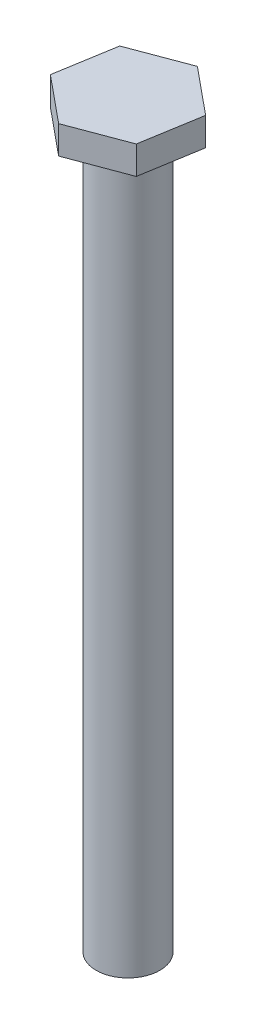
ISO-10303-21;
HEADER;
FILE_DESCRIPTION(('STEP AP214'),'2;1');
FILE_NAME('part.step','',(''),(''),'','','');
FILE_SCHEMA(('AUTOMOTIVE_DESIGN { 1 0 10303 214 1 1 1 1 }'));
ENDSEC;
DATA;
#1=APPLICATION_CONTEXT('core data for automotive mechanical design processes');
#2=APPLICATION_PROTOCOL_DEFINITION('international standard','automotive_design',2000,#1);
#3=PRODUCT_CONTEXT('',#1,'mechanical');
#4=PRODUCT('Part','Part','',(#3));
#5=PRODUCT_RELATED_PRODUCT_CATEGORY('part','',(#4));
#6=PRODUCT_DEFINITION_FORMATION('','',#4);
#7=PRODUCT_DEFINITION_CONTEXT('part definition',#1,'design');
#8=PRODUCT_DEFINITION('design','',#6,#7);
#9=PRODUCT_DEFINITION_SHAPE('','',#8);
#10=(LENGTH_UNIT() NAMED_UNIT(*) SI_UNIT(.MILLI.,.METRE.));
#11=(NAMED_UNIT(*) PLANE_ANGLE_UNIT() SI_UNIT($,.RADIAN.));
#12=(NAMED_UNIT(*) SI_UNIT($,.STERADIAN.) SOLID_ANGLE_UNIT());
#13=UNCERTAINTY_MEASURE_WITH_UNIT(LENGTH_MEASURE(1.E-05),#10,'distance_accuracy_value','');
#14=(GEOMETRIC_REPRESENTATION_CONTEXT(3) GLOBAL_UNCERTAINTY_ASSIGNED_CONTEXT((#13)) GLOBAL_UNIT_ASSIGNED_CONTEXT((#10,
#11,#12)) REPRESENTATION_CONTEXT('',''));
#15=CARTESIAN_POINT('',(0.,0.,0.));
#16=DIRECTION('',(0.,0.,1.));
#17=DIRECTION('',(1.,0.,0.));
#18=AXIS2_PLACEMENT_3D('',#15,#16,#17);
#19=CARTESIAN_POINT('',(0.,-177.8,0.));
#20=DIRECTION('',(0.,1.,0.));
#21=DIRECTION('',(0.,0.,1.));
#22=AXIS2_PLACEMENT_3D('',#19,#20,#21);
#23=CYLINDRICAL_SURFACE('',#22,7.9375);
#24=CARTESIAN_POINT('',(0.,-177.8,0.));
#25=DIRECTION('',(0.,1.,0.));
#26=DIRECTION('',(0.,0.,1.));
#27=AXIS2_PLACEMENT_3D('',#24,#25,#26);
#28=CIRCLE('',#27,7.9375);
#29=CARTESIAN_POINT('',(0.,-177.8,7.9375));
#30=VERTEX_POINT('',#29);
#31=EDGE_CURVE('E11',#30,#30,#28,.T.);
#32=ORIENTED_EDGE('',*,*,#31,.T.);
#33=EDGE_LOOP('',(#32));
#34=FACE_BOUND('',#33,.T.);
#35=CARTESIAN_POINT('',(0.,0.,0.));
#36=DIRECTION('',(0.,1.,0.));
#37=DIRECTION('',(0.,0.,1.));
#38=AXIS2_PLACEMENT_3D('',#35,#36,#37);
#39=CIRCLE('',#38,7.9375);
#40=CARTESIAN_POINT('',(0.,0.,7.9375));
#41=VERTEX_POINT('',#40);
#42=EDGE_CURVE('E35',#41,#41,#39,.T.);
#43=ORIENTED_EDGE('',*,*,#42,.F.);
#44=EDGE_LOOP('',(#43));
#45=FACE_BOUND('',#44,.T.);
#46=ADVANCED_FACE('F32',(#34,#45),#23,.T.);
#47=CARTESIAN_POINT('',(0.,-177.8,0.));
#48=DIRECTION('',(0.,1.,0.));
#49=DIRECTION('',(0.,0.,1.));
#50=AXIS2_PLACEMENT_3D('',#47,#48,#49);
#51=PLANE('',#50);
#52=ORIENTED_EDGE('',*,*,#31,.F.);
#53=EDGE_LOOP('',(#52));
#54=FACE_BOUND('',#53,.T.);
#55=ADVANCED_FACE('F143',(#54),#51,.F.);
#56=CARTESIAN_POINT('',(-2.45878019902812,7.,14.8083670020094));
#57=DIRECTION('',(-0.351394296683121,0.,-0.936227562219023));
#58=DIRECTION('',(-0.936227562219023,0.,0.351394296683121));
#59=AXIS2_PLACEMENT_3D('',#56,#57,#58);
#60=PLANE('',#59);
#61=DIRECTION('',(0.936227562219023,0.,-0.351394296683121));
#62=VECTOR('',#61,1.);
#63=CARTESIAN_POINT('',(-2.45878019902812,0.,14.8083670020094));
#64=LINE('',#63,#62);
#65=CARTESIAN_POINT('',(-2.45878019902812,0.,14.8083670020094));
#66=VERTEX_POINT('',#65);
#67=CARTESIAN_POINT('',(11.5950319127893,0.,9.5335496156852));
#68=VERTEX_POINT('',#67);
#69=EDGE_CURVE('E117',#66,#68,#64,.T.);
#70=ORIENTED_EDGE('',*,*,#69,.T.);
#71=DIRECTION('',(0.,-1.,0.));
#72=VECTOR('',#71,1.);
#73=CARTESIAN_POINT('',(11.5950319127893,7.,9.5335496156852));
#74=LINE('',#73,#72);
#75=CARTESIAN_POINT('',(11.5950319127893,7.,9.5335496156852));
#76=VERTEX_POINT('',#75);
#77=EDGE_CURVE('E134',#76,#68,#74,.T.);
#78=ORIENTED_EDGE('',*,*,#77,.F.);
#79=DIRECTION('',(0.936227562219023,0.,-0.351394296683121));
#80=VECTOR('',#79,1.);
#81=CARTESIAN_POINT('',(-2.45878019902812,7.,14.8083670020094));
#82=LINE('',#81,#80);
#83=CARTESIAN_POINT('',(-2.45878019902812,7.,14.8083670020094));
#84=VERTEX_POINT('',#83);
#85=EDGE_CURVE('E127',#84,#76,#82,.T.);
#86=ORIENTED_EDGE('',*,*,#85,.F.);
#87=DIRECTION('',(0.,-1.,0.));
#88=VECTOR('',#87,1.);
#89=CARTESIAN_POINT('',(-2.45878019902812,7.,14.8083670020094));
#90=LINE('',#89,#88);
#91=EDGE_CURVE('E113',#84,#66,#90,.T.);
#92=ORIENTED_EDGE('',*,*,#91,.T.);
#93=EDGE_LOOP('',(#70,#78,#86,#92));
#94=FACE_BOUND('',#93,.T.);
#95=ADVANCED_FACE('F148',(#94),#60,.F.);
#96=CARTESIAN_POINT('',(11.5950319127893,7.,9.5335496156852));
#97=DIRECTION('',(-0.986494000946411,0.,-0.163797393436962));
#98=DIRECTION('',(-0.163797393436962,0.,0.986494000946411));
#99=AXIS2_PLACEMENT_3D('',#96,#97,#98);
#100=PLANE('',#99);
#101=DIRECTION('',(0.163797393436962,0.,-0.986494000946411));
#102=VECTOR('',#101,1.);
#103=CARTESIAN_POINT('',(11.5950319127893,0.,9.5335496156852));
#104=LINE('',#103,#102);
#105=CARTESIAN_POINT('',(14.0538121118174,0.,-5.27481738632418));
#106=VERTEX_POINT('',#105);
#107=EDGE_CURVE('E120',#68,#106,#104,.T.);
#108=ORIENTED_EDGE('',*,*,#107,.T.);
#109=DIRECTION('',(0.,-1.,0.));
#110=VECTOR('',#109,1.);
#111=CARTESIAN_POINT('',(14.0538121118174,7.,-5.27481738632418));
#112=LINE('',#111,#110);
#113=CARTESIAN_POINT('',(14.0538121118174,7.,-5.27481738632418));
#114=VERTEX_POINT('',#113);
#115=EDGE_CURVE('E131',#114,#106,#112,.T.);
#116=ORIENTED_EDGE('',*,*,#115,.F.);
#117=DIRECTION('',(0.163797393436962,0.,-0.986494000946411));
#118=VECTOR('',#117,1.);
#119=CARTESIAN_POINT('',(11.5950319127893,7.,9.5335496156852));
#120=LINE('',#119,#118);
#121=EDGE_CURVE('E86',#76,#114,#120,.T.);
#122=ORIENTED_EDGE('',*,*,#121,.F.);
#123=ORIENTED_EDGE('',*,*,#77,.T.);
#124=EDGE_LOOP('',(#108,#116,#122,#123));
#125=FACE_BOUND('',#124,.T.);
#126=ADVANCED_FACE('F154',(#125),#100,.F.);
#127=CARTESIAN_POINT('',(14.0538121118174,7.,-5.27481738632418));
#128=DIRECTION('',(-0.63509970426329,0.,0.77243016878206));
#129=DIRECTION('',(0.77243016878206,0.,0.63509970426329));
#130=AXIS2_PLACEMENT_3D('',#127,#128,#129);
#131=PLANE('',#130);
#132=DIRECTION('',(-0.77243016878206,0.,-0.635099704263289));
#133=VECTOR('',#132,1.);
#134=CARTESIAN_POINT('',(14.0538121118174,0.,-5.27481738632418));
#135=LINE('',#134,#133);
#136=CARTESIAN_POINT('',(2.45878019902812,0.,-14.8083670020094));
#137=VERTEX_POINT('',#136);
#138=EDGE_CURVE('E122',#106,#137,#135,.T.);
#139=ORIENTED_EDGE('',*,*,#138,.T.);
#140=DIRECTION('',(0.,-1.,0.));
#141=VECTOR('',#140,1.);
#142=CARTESIAN_POINT('',(2.45878019902812,7.,-14.8083670020094));
#143=LINE('',#142,#141);
#144=CARTESIAN_POINT('',(2.45878019902812,7.,-14.8083670020094));
#145=VERTEX_POINT('',#144);
#146=EDGE_CURVE('E108',#145,#137,#143,.T.);
#147=ORIENTED_EDGE('',*,*,#146,.F.);
#148=DIRECTION('',(-0.77243016878206,0.,-0.635099704263289));
#149=VECTOR('',#148,1.);
#150=CARTESIAN_POINT('',(14.0538121118174,7.,-5.27481738632418));
#151=LINE('',#150,#149);
#152=EDGE_CURVE('E99',#114,#145,#151,.T.);
#153=ORIENTED_EDGE('',*,*,#152,.F.);
#154=ORIENTED_EDGE('',*,*,#115,.T.);
#155=EDGE_LOOP('',(#139,#147,#153,#154));
#156=FACE_BOUND('',#155,.T.);
#157=ADVANCED_FACE('F160',(#156),#131,.F.);
#158=CARTESIAN_POINT('',(2.45878019902812,7.,-14.8083670020094));
#159=DIRECTION('',(0.351394296683121,0.,0.936227562219023));
#160=DIRECTION('',(0.936227562219023,0.,-0.351394296683121));
#161=AXIS2_PLACEMENT_3D('',#158,#159,#160);
#162=PLANE('',#161);
#163=DIRECTION('',(-0.936227562219023,0.,0.351394296683121));
#164=VECTOR('',#163,1.);
#165=CARTESIAN_POINT('',(2.45878019902812,0.,-14.8083670020094));
#166=LINE('',#165,#164);
#167=CARTESIAN_POINT('',(-11.5950319127893,0.,-9.53354961568521));
#168=VERTEX_POINT('',#167);
#169=EDGE_CURVE('E107',#137,#168,#166,.T.);
#170=ORIENTED_EDGE('',*,*,#169,.T.);
#171=DIRECTION('',(0.,-1.,0.));
#172=VECTOR('',#171,1.);
#173=CARTESIAN_POINT('',(-11.5950319127893,7.,-9.53354961568521));
#174=LINE('',#173,#172);
#175=CARTESIAN_POINT('',(-11.5950319127893,7.,-9.53354961568521));
#176=VERTEX_POINT('',#175);
#177=EDGE_CURVE('E104',#176,#168,#174,.T.);
#178=ORIENTED_EDGE('',*,*,#177,.F.);
#179=DIRECTION('',(-0.936227562219023,0.,0.351394296683121));
#180=VECTOR('',#179,1.);
#181=CARTESIAN_POINT('',(2.45878019902812,7.,-14.8083670020094));
#182=LINE('',#181,#180);
#183=EDGE_CURVE('E93',#145,#176,#182,.T.);
#184=ORIENTED_EDGE('',*,*,#183,.F.);
#185=ORIENTED_EDGE('',*,*,#146,.T.);
#186=EDGE_LOOP('',(#170,#178,#184,#185));
#187=FACE_BOUND('',#186,.T.);
#188=ADVANCED_FACE('F105',(#187),#162,.F.);
#189=CARTESIAN_POINT('',(-11.5950319127893,7.,-9.53354961568521));
#190=DIRECTION('',(0.986494000946411,0.,0.163797393436963));
#191=DIRECTION('',(0.163797393436963,0.,-0.986494000946411));
#192=AXIS2_PLACEMENT_3D('',#189,#190,#191);
#193=PLANE('',#192);
#194=DIRECTION('',(-0.163797393436963,0.,0.986494000946411));
#195=VECTOR('',#194,1.);
#196=CARTESIAN_POINT('',(-11.5950319127893,0.,-9.53354961568521));
#197=LINE('',#196,#195);
#198=CARTESIAN_POINT('',(-14.0538121118174,0.,5.27481738632418));
#199=VERTEX_POINT('',#198);
#200=EDGE_CURVE('E71',#168,#199,#197,.T.);
#201=ORIENTED_EDGE('',*,*,#200,.T.);
#202=DIRECTION('',(0.,-1.,0.));
#203=VECTOR('',#202,1.);
#204=CARTESIAN_POINT('',(-14.0538121118174,7.,5.27481738632418));
#205=LINE('',#204,#203);
#206=CARTESIAN_POINT('',(-14.0538121118174,7.,5.27481738632418));
#207=VERTEX_POINT('',#206);
#208=EDGE_CURVE('E109',#207,#199,#205,.T.);
#209=ORIENTED_EDGE('',*,*,#208,.F.);
#210=DIRECTION('',(-0.163797393436963,0.,0.986494000946411));
#211=VECTOR('',#210,1.);
#212=CARTESIAN_POINT('',(-11.5950319127893,7.,-9.53354961568521));
#213=LINE('',#212,#211);
#214=EDGE_CURVE('E97',#176,#207,#213,.T.);
#215=ORIENTED_EDGE('',*,*,#214,.F.);
#216=ORIENTED_EDGE('',*,*,#177,.T.);
#217=EDGE_LOOP('',(#201,#209,#215,#216));
#218=FACE_BOUND('',#217,.T.);
#219=ADVANCED_FACE('F111',(#218),#193,.F.);
#220=CARTESIAN_POINT('',(-14.0538121118174,7.,5.27481738632418));
#221=DIRECTION('',(0.635099704263289,0.,-0.77243016878206));
#222=DIRECTION('',(-0.772430168782061,0.,-0.635099704263289));
#223=AXIS2_PLACEMENT_3D('',#220,#221,#222);
#224=PLANE('',#223);
#225=DIRECTION('',(0.77243016878206,0.,0.635099704263289));
#226=VECTOR('',#225,1.);
#227=CARTESIAN_POINT('',(-14.0538121118174,0.,5.27481738632418));
#228=LINE('',#227,#226);
#229=EDGE_CURVE('E77',#199,#66,#228,.T.);
#230=ORIENTED_EDGE('',*,*,#229,.T.);
#231=ORIENTED_EDGE('',*,*,#91,.F.);
#232=DIRECTION('',(0.77243016878206,0.,0.635099704263289));
#233=VECTOR('',#232,1.);
#234=CARTESIAN_POINT('',(-14.0538121118174,7.,5.27481738632418));
#235=LINE('',#234,#233);
#236=EDGE_CURVE('E48',#207,#84,#235,.T.);
#237=ORIENTED_EDGE('',*,*,#236,.F.);
#238=ORIENTED_EDGE('',*,*,#208,.T.);
#239=EDGE_LOOP('',(#230,#231,#237,#238));
#240=FACE_BOUND('',#239,.T.);
#241=ADVANCED_FACE('F168',(#240),#224,.F.);
#242=CARTESIAN_POINT('',(0.,7.,0.));
#243=DIRECTION('',(0.,1.,0.));
#244=DIRECTION('',(0.,0.,1.));
#245=AXIS2_PLACEMENT_3D('',#242,#243,#244);
#246=PLANE('',#245);
#247=ORIENTED_EDGE('',*,*,#85,.T.);
#248=ORIENTED_EDGE('',*,*,#121,.T.);
#249=ORIENTED_EDGE('',*,*,#152,.T.);
#250=ORIENTED_EDGE('',*,*,#183,.T.);
#251=ORIENTED_EDGE('',*,*,#214,.T.);
#252=ORIENTED_EDGE('',*,*,#236,.T.);
#253=EDGE_LOOP('',(#247,#248,#249,#250,#251,#252));
#254=FACE_BOUND('',#253,.T.);
#255=ADVANCED_FACE('F95',(#254),#246,.T.);
#256=CARTESIAN_POINT('',(0.,0.,0.));
#257=DIRECTION('',(0.,1.,0.));
#258=DIRECTION('',(0.,0.,1.));
#259=AXIS2_PLACEMENT_3D('',#256,#257,#258);
#260=PLANE('',#259);
#261=ORIENTED_EDGE('',*,*,#42,.T.);
#262=EDGE_LOOP('',(#261));
#263=FACE_BOUND('',#262,.T.);
#264=ORIENTED_EDGE('',*,*,#69,.F.);
#265=ORIENTED_EDGE('',*,*,#229,.F.);
#266=ORIENTED_EDGE('',*,*,#200,.F.);
#267=ORIENTED_EDGE('',*,*,#169,.F.);
#268=ORIENTED_EDGE('',*,*,#138,.F.);
#269=ORIENTED_EDGE('',*,*,#107,.F.);
#270=EDGE_LOOP('',(#264,#265,#266,#267,#268,#269));
#271=FACE_BOUND('',#270,.T.);
#272=ADVANCED_FACE('F139',(#263,#271),#260,.F.);
#273=CLOSED_SHELL('',(#46,#55,#95,#126,#157,#188,#219,#241,#255,#272));
#274=MANIFOLD_SOLID_BREP('B2',#273);
#275=ADVANCED_BREP_SHAPE_REPRESENTATION('',(#18,#274),#14);
#276=SHAPE_DEFINITION_REPRESENTATION(#9,#275);
ENDSEC;
END-ISO-10303-21;
